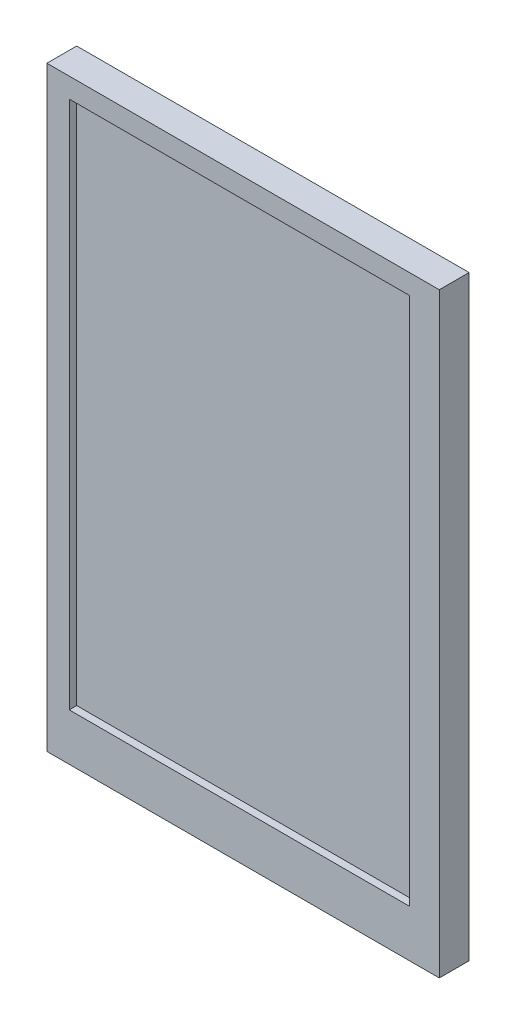
ISO-10303-21;
HEADER;
FILE_DESCRIPTION(('STEP AP214'),'2;1');
FILE_NAME('part.step','',(''),(''),'','','');
FILE_SCHEMA(('AUTOMOTIVE_DESIGN { 1 0 10303 214 1 1 1 1 }'));
ENDSEC;
DATA;
#1=APPLICATION_CONTEXT('core data for automotive mechanical design processes');
#2=APPLICATION_PROTOCOL_DEFINITION('international standard','automotive_design',2000,#1);
#3=PRODUCT_CONTEXT('',#1,'mechanical');
#4=PRODUCT('Part','Part','',(#3));
#5=PRODUCT_RELATED_PRODUCT_CATEGORY('part','',(#4));
#6=PRODUCT_DEFINITION_FORMATION('','',#4);
#7=PRODUCT_DEFINITION_CONTEXT('part definition',#1,'design');
#8=PRODUCT_DEFINITION('design','',#6,#7);
#9=PRODUCT_DEFINITION_SHAPE('','',#8);
#10=(LENGTH_UNIT() NAMED_UNIT(*) SI_UNIT(.MILLI.,.METRE.));
#11=(NAMED_UNIT(*) PLANE_ANGLE_UNIT() SI_UNIT($,.RADIAN.));
#12=(NAMED_UNIT(*) SI_UNIT($,.STERADIAN.) SOLID_ANGLE_UNIT());
#13=UNCERTAINTY_MEASURE_WITH_UNIT(LENGTH_MEASURE(1.E-05),#10,'distance_accuracy_value','');
#14=(GEOMETRIC_REPRESENTATION_CONTEXT(3) GLOBAL_UNCERTAINTY_ASSIGNED_CONTEXT((#13)) GLOBAL_UNIT_ASSIGNED_CONTEXT((#10,
#11,#12)) REPRESENTATION_CONTEXT('',''));
#15=CARTESIAN_POINT('',(0.,0.,0.));
#16=DIRECTION('',(0.,0.,1.));
#17=DIRECTION('',(1.,0.,0.));
#18=AXIS2_PLACEMENT_3D('',#15,#16,#17);
#19=CARTESIAN_POINT('',(-79.,-120.,12.));
#20=DIRECTION('',(0.,1.,0.));
#21=DIRECTION('',(-1.,0.,0.));
#22=AXIS2_PLACEMENT_3D('',#19,#20,#21);
#23=PLANE('',#22);
#24=DIRECTION('',(1.,0.,0.));
#25=VECTOR('',#24,1.);
#26=CARTESIAN_POINT('',(-79.,-120.,0.));
#27=LINE('',#26,#25);
#28=CARTESIAN_POINT('',(-79.,-120.,0.));
#29=VERTEX_POINT('',#28);
#30=CARTESIAN_POINT('',(79.,-120.,0.));
#31=VERTEX_POINT('',#30);
#32=EDGE_CURVE('E168',#29,#31,#27,.T.);
#33=ORIENTED_EDGE('',*,*,#32,.T.);
#34=DIRECTION('',(0.,0.,-1.));
#35=VECTOR('',#34,1.);
#36=CARTESIAN_POINT('',(79.,-120.,12.));
#37=LINE('',#36,#35);
#38=CARTESIAN_POINT('',(79.,-120.,12.));
#39=VERTEX_POINT('',#38);
#40=EDGE_CURVE('E11',#39,#31,#37,.T.);
#41=ORIENTED_EDGE('',*,*,#40,.F.);
#42=DIRECTION('',(1.,0.,0.));
#43=VECTOR('',#42,1.);
#44=CARTESIAN_POINT('',(-79.,-120.,12.));
#45=LINE('',#44,#43);
#46=CARTESIAN_POINT('',(-79.,-120.,12.));
#47=VERTEX_POINT('',#46);
#48=EDGE_CURVE('E174',#47,#39,#45,.T.);
#49=ORIENTED_EDGE('',*,*,#48,.F.);
#50=DIRECTION('',(0.,0.,-1.));
#51=VECTOR('',#50,1.);
#52=CARTESIAN_POINT('',(-79.,-120.,12.));
#53=LINE('',#52,#51);
#54=EDGE_CURVE('E184',#47,#29,#53,.T.);
#55=ORIENTED_EDGE('',*,*,#54,.T.);
#56=EDGE_LOOP('',(#33,#41,#49,#55));
#57=FACE_BOUND('',#56,.T.);
#58=ADVANCED_FACE('F49',(#57),#23,.F.);
#59=CARTESIAN_POINT('',(79.,-120.,12.));
#60=DIRECTION('',(-1.,0.,0.));
#61=DIRECTION('',(0.,-1.,0.));
#62=AXIS2_PLACEMENT_3D('',#59,#60,#61);
#63=PLANE('',#62);
#64=DIRECTION('',(0.,1.,0.));
#65=VECTOR('',#64,1.);
#66=CARTESIAN_POINT('',(79.,-120.,0.));
#67=LINE('',#66,#65);
#68=CARTESIAN_POINT('',(79.,120.,0.));
#69=VERTEX_POINT('',#68);
#70=EDGE_CURVE('E188',#31,#69,#67,.T.);
#71=ORIENTED_EDGE('',*,*,#70,.T.);
#72=DIRECTION('',(0.,0.,-1.));
#73=VECTOR('',#72,1.);
#74=CARTESIAN_POINT('',(79.,120.,12.));
#75=LINE('',#74,#73);
#76=CARTESIAN_POINT('',(79.,120.,12.));
#77=VERTEX_POINT('',#76);
#78=EDGE_CURVE('E57',#77,#69,#75,.T.);
#79=ORIENTED_EDGE('',*,*,#78,.F.);
#80=DIRECTION('',(0.,1.,0.));
#81=VECTOR('',#80,1.);
#82=CARTESIAN_POINT('',(79.,-120.,12.));
#83=LINE('',#82,#81);
#84=EDGE_CURVE('E101',#39,#77,#83,.T.);
#85=ORIENTED_EDGE('',*,*,#84,.F.);
#86=ORIENTED_EDGE('',*,*,#40,.T.);
#87=EDGE_LOOP('',(#71,#79,#85,#86));
#88=FACE_BOUND('',#87,.T.);
#89=ADVANCED_FACE('F224',(#88),#63,.F.);
#90=CARTESIAN_POINT('',(-79.,120.,12.));
#91=DIRECTION('',(0.,-1.,0.));
#92=DIRECTION('',(0.,0.,-1.));
#93=AXIS2_PLACEMENT_3D('',#90,#91,#92);
#94=PLANE('',#93);
#95=DIRECTION('',(-1.,0.,0.));
#96=VECTOR('',#95,1.);
#97=CARTESIAN_POINT('',(-79.,120.,0.));
#98=LINE('',#97,#96);
#99=CARTESIAN_POINT('',(-79.,120.,0.));
#100=VERTEX_POINT('',#99);
#101=EDGE_CURVE('E191',#69,#100,#98,.T.);
#102=ORIENTED_EDGE('',*,*,#101,.T.);
#103=DIRECTION('',(0.,0.,-1.));
#104=VECTOR('',#103,1.);
#105=CARTESIAN_POINT('',(-79.,120.,12.));
#106=LINE('',#105,#104);
#107=CARTESIAN_POINT('',(-79.,120.,12.));
#108=VERTEX_POINT('',#107);
#109=EDGE_CURVE('E198',#108,#100,#106,.T.);
#110=ORIENTED_EDGE('',*,*,#109,.F.);
#111=DIRECTION('',(-1.,0.,0.));
#112=VECTOR('',#111,1.);
#113=CARTESIAN_POINT('',(-79.,120.,12.));
#114=LINE('',#113,#112);
#115=EDGE_CURVE('E179',#77,#108,#114,.T.);
#116=ORIENTED_EDGE('',*,*,#115,.F.);
#117=ORIENTED_EDGE('',*,*,#78,.T.);
#118=EDGE_LOOP('',(#102,#110,#116,#117));
#119=FACE_BOUND('',#118,.T.);
#120=ADVANCED_FACE('F205',(#119),#94,.F.);
#121=CARTESIAN_POINT('',(-79.,-120.,12.));
#122=DIRECTION('',(1.,0.,0.));
#123=DIRECTION('',(0.,1.,0.));
#124=AXIS2_PLACEMENT_3D('',#121,#122,#123);
#125=PLANE('',#124);
#126=DIRECTION('',(0.,-1.,0.));
#127=VECTOR('',#126,1.);
#128=CARTESIAN_POINT('',(-79.,-120.,0.));
#129=LINE('',#128,#127);
#130=EDGE_CURVE('E94',#100,#29,#129,.T.);
#131=ORIENTED_EDGE('',*,*,#130,.T.);
#132=ORIENTED_EDGE('',*,*,#54,.F.);
#133=DIRECTION('',(0.,-1.,0.));
#134=VECTOR('',#133,1.);
#135=CARTESIAN_POINT('',(-79.,-120.,12.));
#136=LINE('',#135,#134);
#137=EDGE_CURVE('E73',#108,#47,#136,.T.);
#138=ORIENTED_EDGE('',*,*,#137,.F.);
#139=ORIENTED_EDGE('',*,*,#109,.T.);
#140=EDGE_LOOP('',(#131,#132,#138,#139));
#141=FACE_BOUND('',#140,.T.);
#142=ADVANCED_FACE('F213',(#141),#125,.F.);
#143=CARTESIAN_POINT('',(0.,0.,12.));
#144=DIRECTION('',(0.,0.,1.));
#145=DIRECTION('',(1.,0.,0.));
#146=AXIS2_PLACEMENT_3D('',#143,#144,#145);
#147=PLANE('',#146);
#148=DIRECTION('',(0.,-1.,0.));
#149=VECTOR('',#148,1.);
#150=CARTESIAN_POINT('',(-70.,-101.,12.));
#151=LINE('',#150,#149);
#152=CARTESIAN_POINT('',(-70.,112.,12.));
#153=VERTEX_POINT('',#152);
#154=CARTESIAN_POINT('',(-70.,-101.,12.));
#155=VERTEX_POINT('',#154);
#156=EDGE_CURVE('E64',#153,#155,#151,.T.);
#157=ORIENTED_EDGE('',*,*,#156,.F.);
#158=DIRECTION('',(-1.,0.,0.));
#159=VECTOR('',#158,1.);
#160=CARTESIAN_POINT('',(-70.,112.,12.));
#161=LINE('',#160,#159);
#162=CARTESIAN_POINT('',(67.,112.,12.));
#163=VERTEX_POINT('',#162);
#164=EDGE_CURVE('E146',#163,#153,#161,.T.);
#165=ORIENTED_EDGE('',*,*,#164,.F.);
#166=DIRECTION('',(0.,1.,0.));
#167=VECTOR('',#166,1.);
#168=CARTESIAN_POINT('',(67.,-101.,12.));
#169=LINE('',#168,#167);
#170=CARTESIAN_POINT('',(67.,-101.,12.));
#171=VERTEX_POINT('',#170);
#172=EDGE_CURVE('E150',#171,#163,#169,.T.);
#173=ORIENTED_EDGE('',*,*,#172,.F.);
#174=DIRECTION('',(1.,0.,0.));
#175=VECTOR('',#174,1.);
#176=CARTESIAN_POINT('',(-70.,-101.,12.));
#177=LINE('',#176,#175);
#178=EDGE_CURVE('E159',#155,#171,#177,.T.);
#179=ORIENTED_EDGE('',*,*,#178,.F.);
#180=EDGE_LOOP('',(#157,#165,#173,#179));
#181=FACE_BOUND('',#180,.T.);
#182=ORIENTED_EDGE('',*,*,#48,.T.);
#183=ORIENTED_EDGE('',*,*,#84,.T.);
#184=ORIENTED_EDGE('',*,*,#115,.T.);
#185=ORIENTED_EDGE('',*,*,#137,.T.);
#186=EDGE_LOOP('',(#182,#183,#184,#185));
#187=FACE_BOUND('',#186,.T.);
#188=ADVANCED_FACE('F215',(#181,#187),#147,.T.);
#189=CARTESIAN_POINT('',(0.,0.,0.));
#190=DIRECTION('',(0.,0.,1.));
#191=DIRECTION('',(1.,0.,0.));
#192=AXIS2_PLACEMENT_3D('',#189,#190,#191);
#193=PLANE('',#192);
#194=ORIENTED_EDGE('',*,*,#32,.F.);
#195=ORIENTED_EDGE('',*,*,#130,.F.);
#196=ORIENTED_EDGE('',*,*,#101,.F.);
#197=ORIENTED_EDGE('',*,*,#70,.F.);
#198=EDGE_LOOP('',(#194,#195,#196,#197));
#199=FACE_BOUND('',#198,.T.);
#200=ADVANCED_FACE('F209',(#199),#193,.F.);
#201=CARTESIAN_POINT('',(-70.,-101.,9.));
#202=DIRECTION('',(-1.,0.,0.));
#203=DIRECTION('',(0.,0.,1.));
#204=AXIS2_PLACEMENT_3D('',#201,#202,#203);
#205=PLANE('',#204);
#206=ORIENTED_EDGE('',*,*,#156,.T.);
#207=DIRECTION('',(0.,0.,1.));
#208=VECTOR('',#207,1.);
#209=CARTESIAN_POINT('',(-70.,-101.,9.));
#210=LINE('',#209,#208);
#211=CARTESIAN_POINT('',(-70.,-101.,9.));
#212=VERTEX_POINT('',#211);
#213=EDGE_CURVE('E121',#212,#155,#210,.T.);
#214=ORIENTED_EDGE('',*,*,#213,.F.);
#215=DIRECTION('',(0.,-1.,0.));
#216=VECTOR('',#215,1.);
#217=CARTESIAN_POINT('',(-70.,-101.,9.));
#218=LINE('',#217,#216);
#219=CARTESIAN_POINT('',(-70.,112.,9.));
#220=VERTEX_POINT('',#219);
#221=EDGE_CURVE('E125',#220,#212,#218,.T.);
#222=ORIENTED_EDGE('',*,*,#221,.F.);
#223=DIRECTION('',(0.,0.,1.));
#224=VECTOR('',#223,1.);
#225=CARTESIAN_POINT('',(-70.,112.,9.));
#226=LINE('',#225,#224);
#227=EDGE_CURVE('E165',#220,#153,#226,.T.);
#228=ORIENTED_EDGE('',*,*,#227,.T.);
#229=EDGE_LOOP('',(#206,#214,#222,#228));
#230=FACE_BOUND('',#229,.T.);
#231=ADVANCED_FACE('F123',(#230),#205,.F.);
#232=CARTESIAN_POINT('',(-70.,112.,9.));
#233=DIRECTION('',(0.,1.,0.));
#234=DIRECTION('',(0.,0.,1.));
#235=AXIS2_PLACEMENT_3D('',#232,#233,#234);
#236=PLANE('',#235);
#237=ORIENTED_EDGE('',*,*,#164,.T.);
#238=ORIENTED_EDGE('',*,*,#227,.F.);
#239=DIRECTION('',(-1.,0.,0.));
#240=VECTOR('',#239,1.);
#241=CARTESIAN_POINT('',(-70.,112.,9.));
#242=LINE('',#241,#240);
#243=CARTESIAN_POINT('',(67.,112.,9.));
#244=VERTEX_POINT('',#243);
#245=EDGE_CURVE('E132',#244,#220,#242,.T.);
#246=ORIENTED_EDGE('',*,*,#245,.F.);
#247=DIRECTION('',(0.,0.,1.));
#248=VECTOR('',#247,1.);
#249=CARTESIAN_POINT('',(67.,112.,9.));
#250=LINE('',#249,#248);
#251=EDGE_CURVE('E169',#244,#163,#250,.T.);
#252=ORIENTED_EDGE('',*,*,#251,.T.);
#253=EDGE_LOOP('',(#237,#238,#246,#252));
#254=FACE_BOUND('',#253,.T.);
#255=ADVANCED_FACE('F265',(#254),#236,.F.);
#256=CARTESIAN_POINT('',(67.,-101.,9.));
#257=DIRECTION('',(1.,0.,0.));
#258=DIRECTION('',(0.,0.,-1.));
#259=AXIS2_PLACEMENT_3D('',#256,#257,#258);
#260=PLANE('',#259);
#261=ORIENTED_EDGE('',*,*,#172,.T.);
#262=ORIENTED_EDGE('',*,*,#251,.F.);
#263=DIRECTION('',(0.,1.,0.));
#264=VECTOR('',#263,1.);
#265=CARTESIAN_POINT('',(67.,-101.,9.));
#266=LINE('',#265,#264);
#267=CARTESIAN_POINT('',(67.,-101.,9.));
#268=VERTEX_POINT('',#267);
#269=EDGE_CURVE('E141',#268,#244,#266,.T.);
#270=ORIENTED_EDGE('',*,*,#269,.F.);
#271=DIRECTION('',(0.,0.,1.));
#272=VECTOR('',#271,1.);
#273=CARTESIAN_POINT('',(67.,-101.,9.));
#274=LINE('',#273,#272);
#275=EDGE_CURVE('E131',#268,#171,#274,.T.);
#276=ORIENTED_EDGE('',*,*,#275,.T.);
#277=EDGE_LOOP('',(#261,#262,#270,#276));
#278=FACE_BOUND('',#277,.T.);
#279=ADVANCED_FACE('F276',(#278),#260,.F.);
#280=CARTESIAN_POINT('',(-70.,-101.,9.));
#281=DIRECTION('',(0.,-1.,0.));
#282=DIRECTION('',(0.,0.,-1.));
#283=AXIS2_PLACEMENT_3D('',#280,#281,#282);
#284=PLANE('',#283);
#285=ORIENTED_EDGE('',*,*,#178,.T.);
#286=ORIENTED_EDGE('',*,*,#275,.F.);
#287=DIRECTION('',(1.,0.,0.));
#288=VECTOR('',#287,1.);
#289=CARTESIAN_POINT('',(-70.,-101.,9.));
#290=LINE('',#289,#288);
#291=EDGE_CURVE('E135',#212,#268,#290,.T.);
#292=ORIENTED_EDGE('',*,*,#291,.F.);
#293=ORIENTED_EDGE('',*,*,#213,.T.);
#294=EDGE_LOOP('',(#285,#286,#292,#293));
#295=FACE_BOUND('',#294,.T.);
#296=ADVANCED_FACE('F136',(#295),#284,.F.);
#297=CARTESIAN_POINT('',(0.,0.,9.));
#298=DIRECTION('',(0.,0.,-1.));
#299=DIRECTION('',(-1.,0.,0.));
#300=AXIS2_PLACEMENT_3D('',#297,#298,#299);
#301=PLANE('',#300);
#302=ORIENTED_EDGE('',*,*,#221,.T.);
#303=ORIENTED_EDGE('',*,*,#291,.T.);
#304=ORIENTED_EDGE('',*,*,#269,.T.);
#305=ORIENTED_EDGE('',*,*,#245,.T.);
#306=EDGE_LOOP('',(#302,#303,#304,#305));
#307=FACE_BOUND('',#306,.T.);
#308=ADVANCED_FACE('F143',(#307),#301,.F.);
#309=CLOSED_SHELL('',(#58,#89,#120,#142,#188,#200,#231,#255,#279,#296,#308));
#310=MANIFOLD_SOLID_BREP('B2',#309);
#311=ADVANCED_BREP_SHAPE_REPRESENTATION('',(#18,#310),#14);
#312=SHAPE_DEFINITION_REPRESENTATION(#9,#311);
ENDSEC;
END-ISO-10303-21;
